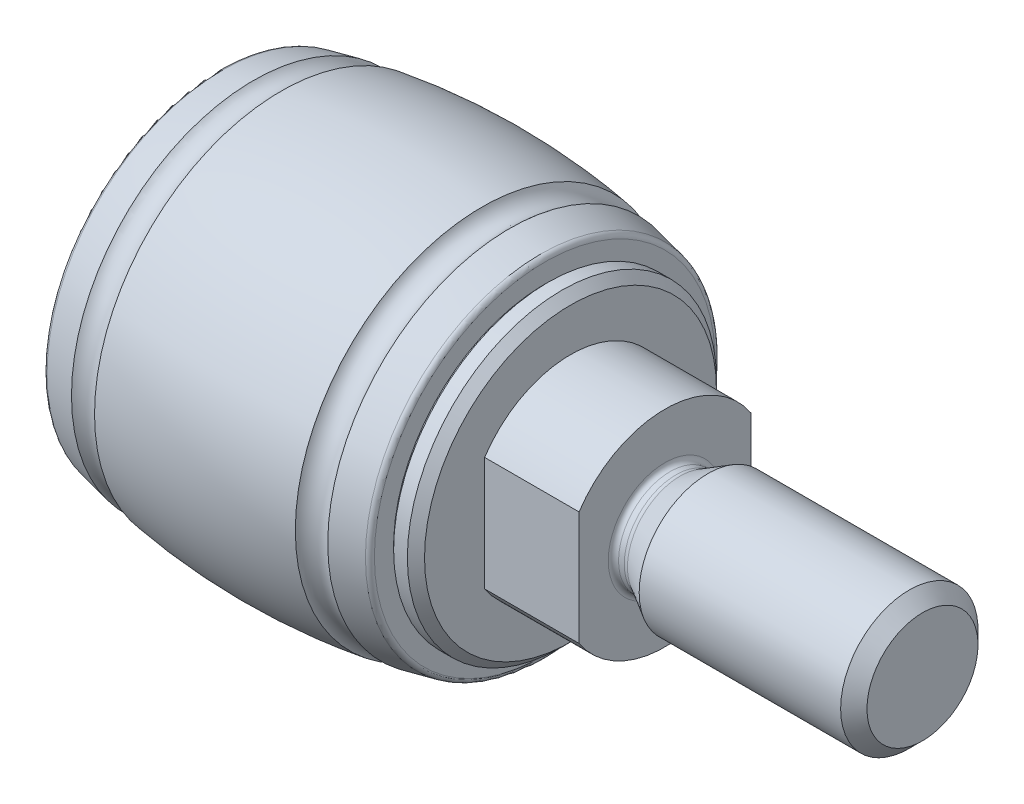
ISO-10303-21;
HEADER;
FILE_DESCRIPTION(('STEP AP214'),'2;1');
FILE_NAME('part.step','',(''),(''),'','','');
FILE_SCHEMA(('AUTOMOTIVE_DESIGN { 1 0 10303 214 1 1 1 1 }'));
ENDSEC;
DATA;
#1=APPLICATION_CONTEXT('core data for automotive mechanical design processes');
#2=APPLICATION_PROTOCOL_DEFINITION('international standard','automotive_design',2000,#1);
#3=PRODUCT_CONTEXT('',#1,'mechanical');
#4=PRODUCT('Part','Part','',(#3));
#5=PRODUCT_RELATED_PRODUCT_CATEGORY('part','',(#4));
#6=PRODUCT_DEFINITION_FORMATION('','',#4);
#7=PRODUCT_DEFINITION_CONTEXT('part definition',#1,'design');
#8=PRODUCT_DEFINITION('design','',#6,#7);
#9=PRODUCT_DEFINITION_SHAPE('','',#8);
#10=(LENGTH_UNIT() NAMED_UNIT(*) SI_UNIT(.MILLI.,.METRE.));
#11=(NAMED_UNIT(*) PLANE_ANGLE_UNIT() SI_UNIT($,.RADIAN.));
#12=(NAMED_UNIT(*) SI_UNIT($,.STERADIAN.) SOLID_ANGLE_UNIT());
#13=UNCERTAINTY_MEASURE_WITH_UNIT(LENGTH_MEASURE(1.E-05),#10,'distance_accuracy_value','');
#14=(GEOMETRIC_REPRESENTATION_CONTEXT(3) GLOBAL_UNCERTAINTY_ASSIGNED_CONTEXT((#13)) GLOBAL_UNIT_ASSIGNED_CONTEXT((#10,
#11,#12)) REPRESENTATION_CONTEXT('',''));
#15=CARTESIAN_POINT('',(0.,0.,0.));
#16=DIRECTION('',(0.,0.,1.));
#17=DIRECTION('',(1.,0.,0.));
#18=AXIS2_PLACEMENT_3D('',#15,#16,#17);
#19=CARTESIAN_POINT('',(260.,0.,0.));
#20=DIRECTION('',(-1.,0.,0.));
#21=DIRECTION('',(0.,0.,1.));
#22=AXIS2_PLACEMENT_3D('',#19,#20,#21);
#23=CYLINDRICAL_SURFACE('',#22,6.);
#24=DIRECTION('',(-1.,0.,0.));
#25=VECTOR('',#24,1.);
#26=CARTESIAN_POINT('',(260.,-3.3166247903554,5.));
#27=LINE('',#26,#25);
#28=CARTESIAN_POINT('',(239.5,-3.3166247903554,5.));
#29=VERTEX_POINT('',#28);
#30=CARTESIAN_POINT('',(245.,-3.3166247903554,5.));
#31=VERTEX_POINT('',#30);
#32=EDGE_CURVE('E59',#29,#31,#27,.F.);
#33=ORIENTED_EDGE('',*,*,#32,.F.);
#34=CARTESIAN_POINT('',(239.5,0.,0.));
#35=DIRECTION('',(-1.,0.,0.));
#36=DIRECTION('',(0.,0.,1.));
#37=AXIS2_PLACEMENT_3D('',#34,#35,#36);
#38=CIRCLE('',#37,6.);
#39=CARTESIAN_POINT('',(239.5,-3.3166247903554,-5.));
#40=VERTEX_POINT('',#39);
#41=EDGE_CURVE('E100',#40,#29,#38,.T.);
#42=ORIENTED_EDGE('',*,*,#41,.F.);
#43=DIRECTION('',(-1.,0.,0.));
#44=VECTOR('',#43,1.);
#45=CARTESIAN_POINT('',(260.,-3.3166247903554,-5.));
#46=LINE('',#45,#44);
#47=CARTESIAN_POINT('',(245.,-3.3166247903554,-5.));
#48=VERTEX_POINT('',#47);
#49=EDGE_CURVE('E85',#48,#40,#46,.T.);
#50=ORIENTED_EDGE('',*,*,#49,.F.);
#51=CARTESIAN_POINT('',(245.,0.,0.));
#52=DIRECTION('',(-1.,0.,0.));
#53=DIRECTION('',(0.,0.,1.));
#54=AXIS2_PLACEMENT_3D('',#51,#52,#53);
#55=CIRCLE('',#54,6.);
#56=EDGE_CURVE('E98',#48,#31,#55,.T.);
#57=ORIENTED_EDGE('',*,*,#56,.T.);
#58=EDGE_LOOP('',(#33,#42,#50,#57));
#59=FACE_BOUND('',#58,.T.);
#60=ADVANCED_FACE('F44',(#59),#23,.T.);
#61=CARTESIAN_POINT('',(238.,9.9192956952868,0.));
#62=DIRECTION('',(1.,0.,0.));
#63=DIRECTION('',(0.,0.,-1.));
#64=AXIS2_PLACEMENT_3D('',#61,#62,#63);
#65=PLANE('',#64);
#66=CARTESIAN_POINT('',(238.,0.,0.));
#67=DIRECTION('',(1.,0.,0.));
#68=DIRECTION('',(0.,0.,-1.));
#69=AXIS2_PLACEMENT_3D('',#66,#67,#68);
#70=CIRCLE('',#69,8.8);
#71=CARTESIAN_POINT('',(238.,0.,-8.8));
#72=VERTEX_POINT('',#71);
#73=EDGE_CURVE('E11',#72,#72,#70,.T.);
#74=ORIENTED_EDGE('',*,*,#73,.F.);
#75=EDGE_LOOP('',(#74));
#76=FACE_BOUND('',#75,.T.);
#77=CARTESIAN_POINT('',(238.,0.,0.));
#78=DIRECTION('',(-1.,0.,0.));
#79=DIRECTION('',(0.,0.,1.));
#80=AXIS2_PLACEMENT_3D('',#77,#78,#79);
#81=CIRCLE('',#80,9.91929569527633);
#82=CARTESIAN_POINT('',(238.,0.,9.91929569527633));
#83=VERTEX_POINT('',#82);
#84=EDGE_CURVE('E125',#83,#83,#81,.T.);
#85=ORIENTED_EDGE('',*,*,#84,.F.);
#86=EDGE_LOOP('',(#85));
#87=FACE_BOUND('',#86,.T.);
#88=ADVANCED_FACE('F167',(#76,#87),#65,.T.);
#89=CARTESIAN_POINT('',(237.699999999986,0.,0.));
#90=DIRECTION('',(-1.,0.,0.));
#91=DIRECTION('',(0.,0.,1.));
#92=AXIS2_PLACEMENT_3D('',#89,#90,#91);
#93=TOROIDAL_SURFACE('',#92,9.91929569527633,0.300000000013543);
#94=ORIENTED_EDGE('',*,*,#84,.T.);
#95=EDGE_LOOP('',(#94));
#96=FACE_BOUND('',#95,.T.);
#97=CARTESIAN_POINT('',(237.76952141058,0.,0.));
#98=DIRECTION('',(-1.,0.,0.));
#99=DIRECTION('',(0.,0.,1.));
#100=AXIS2_PLACEMENT_3D('',#97,#98,#99);
#101=CIRCLE('',#100,10.211129164017);
#102=CARTESIAN_POINT('',(237.76952141058,0.,10.211129164017));
#103=VERTEX_POINT('',#102);
#104=EDGE_CURVE('E128',#103,#103,#101,.T.);
#105=ORIENTED_EDGE('',*,*,#104,.F.);
#106=EDGE_LOOP('',(#105));
#107=FACE_BOUND('',#106,.T.);
#108=ADVANCED_FACE('F175',(#96,#107),#93,.T.);
#109=CARTESIAN_POINT('',(228.500000000643,0.,0.));
#110=DIRECTION('',(-1.,0.,0.));
#111=DIRECTION('',(0.,0.,1.));
#112=AXIS2_PLACEMENT_3D('',#109,#110,#111);
#113=DEGENERATE_TOROIDAL_SURFACE('',#112,28.6999999970046,39.9999999969373,.F.);
#114=ORIENTED_EDGE('',*,*,#104,.T.);
#115=EDGE_LOOP('',(#114));
#116=FACE_BOUND('',#115,.T.);
#117=CARTESIAN_POINT('',(235.96199849014,0.,0.));
#118=DIRECTION('',(-1.,0.,0.));
#119=DIRECTION('',(0.,0.,1.));
#120=AXIS2_PLACEMENT_3D('',#117,#118,#119);
#121=CIRCLE('',#120,10.597819004789);
#122=CARTESIAN_POINT('',(235.96199849014,0.,10.597819004789));
#123=VERTEX_POINT('',#122);
#124=EDGE_CURVE('E131',#123,#123,#121,.T.);
#125=ORIENTED_EDGE('',*,*,#124,.F.);
#126=EDGE_LOOP('',(#125));
#127=FACE_BOUND('',#126,.T.);
#128=ADVANCED_FACE('F305',(#116,#127),#113,.F.);
#129=CARTESIAN_POINT('',(235.249999999998,0.,0.));
#130=DIRECTION('',(-1.,0.,0.));
#131=DIRECTION('',(0.,0.,1.));
#132=AXIS2_PLACEMENT_3D('',#129,#130,#131);
#133=TOROIDAL_SURFACE('',#132,11.3,0.999999999999839);
#134=ORIENTED_EDGE('',*,*,#124,.T.);
#135=EDGE_LOOP('',(#134));
#136=FACE_BOUND('',#135,.T.);
#137=CARTESIAN_POINT('',(234.34700489016,0.,0.));
#138=DIRECTION('',(-1.,0.,0.));
#139=DIRECTION('',(0.,0.,1.));
#140=AXIS2_PLACEMENT_3D('',#137,#138,#139);
#141=CIRCLE('',#140,10.870349174785);
#142=CARTESIAN_POINT('',(234.34700489016,0.,10.870349174785));
#143=VERTEX_POINT('',#142);
#144=EDGE_CURVE('E134',#143,#143,#141,.T.);
#145=ORIENTED_EDGE('',*,*,#144,.F.);
#146=EDGE_LOOP('',(#145));
#147=FACE_BOUND('',#146,.T.);
#148=ADVANCED_FACE('F314',(#136,#147),#133,.F.);
#149=CARTESIAN_POINT('',(228.5,0.,0.));
#150=DIRECTION('',(-1.,0.,0.));
#151=DIRECTION('',(0.,0.,1.));
#152=AXIS2_PLACEMENT_3D('',#149,#150,#151);
#153=DEGENERATE_TOROIDAL_SURFACE('',#152,28.6999999999572,39.9999999999572,.F.);
#154=ORIENTED_EDGE('',*,*,#144,.T.);
#155=EDGE_LOOP('',(#154));
#156=FACE_BOUND('',#155,.T.);
#157=CARTESIAN_POINT('',(222.65299510984,0.,0.));
#158=DIRECTION('',(-1.,0.,0.));
#159=DIRECTION('',(0.,0.,1.));
#160=AXIS2_PLACEMENT_3D('',#157,#158,#159);
#161=CIRCLE('',#160,10.870349174785);
#162=CARTESIAN_POINT('',(222.65299510984,0.,10.870349174785));
#163=VERTEX_POINT('',#162);
#164=EDGE_CURVE('E137',#163,#163,#161,.T.);
#165=ORIENTED_EDGE('',*,*,#164,.F.);
#166=EDGE_LOOP('',(#165));
#167=FACE_BOUND('',#166,.T.);
#168=ADVANCED_FACE('F323',(#156,#167),#153,.F.);
#169=CARTESIAN_POINT('',(221.750000000002,0.,0.));
#170=DIRECTION('',(-1.,0.,0.));
#171=DIRECTION('',(0.,0.,1.));
#172=AXIS2_PLACEMENT_3D('',#169,#170,#171);
#173=TOROIDAL_SURFACE('',#172,11.3,0.999999999999839);
#174=ORIENTED_EDGE('',*,*,#164,.T.);
#175=EDGE_LOOP('',(#174));
#176=FACE_BOUND('',#175,.T.);
#177=CARTESIAN_POINT('',(221.03800150986,0.,0.));
#178=DIRECTION('',(-1.,0.,0.));
#179=DIRECTION('',(0.,0.,1.));
#180=AXIS2_PLACEMENT_3D('',#177,#178,#179);
#181=CIRCLE('',#180,10.597819004789);
#182=CARTESIAN_POINT('',(221.03800150986,0.,10.597819004789));
#183=VERTEX_POINT('',#182);
#184=EDGE_CURVE('E140',#183,#183,#181,.T.);
#185=ORIENTED_EDGE('',*,*,#184,.F.);
#186=EDGE_LOOP('',(#185));
#187=FACE_BOUND('',#186,.T.);
#188=ADVANCED_FACE('F163',(#176,#187),#173,.F.);
#189=CARTESIAN_POINT('',(228.500000000153,0.,0.));
#190=DIRECTION('',(-1.,0.,0.));
#191=DIRECTION('',(0.,0.,1.));
#192=AXIS2_PLACEMENT_3D('',#189,#190,#191);
#193=DEGENERATE_TOROIDAL_SURFACE('',#192,28.7000000007328,40.0000000007485,.F.);
#194=ORIENTED_EDGE('',*,*,#184,.T.);
#195=EDGE_LOOP('',(#194));
#196=FACE_BOUND('',#195,.T.);
#197=CARTESIAN_POINT('',(219.23047866262,0.,0.));
#198=DIRECTION('',(-1.,0.,0.));
#199=DIRECTION('',(0.,0.,1.));
#200=AXIS2_PLACEMENT_3D('',#197,#198,#199);
#201=CIRCLE('',#200,10.211129181455);
#202=CARTESIAN_POINT('',(219.23047866262,0.,10.211129181455));
#203=VERTEX_POINT('',#202);
#204=EDGE_CURVE('E143',#203,#203,#201,.T.);
#205=ORIENTED_EDGE('',*,*,#204,.F.);
#206=EDGE_LOOP('',(#205));
#207=FACE_BOUND('',#206,.T.);
#208=ADVANCED_FACE('F152',(#196,#207),#193,.F.);
#209=CARTESIAN_POINT('',(219.300000000014,0.,0.));
#210=DIRECTION('',(-1.,0.,0.));
#211=DIRECTION('',(0.,0.,1.));
#212=AXIS2_PLACEMENT_3D('',#209,#210,#211);
#213=TOROIDAL_SURFACE('',#212,9.91929569527626,0.300000000013761);
#214=ORIENTED_EDGE('',*,*,#204,.T.);
#215=EDGE_LOOP('',(#214));
#216=FACE_BOUND('',#215,.T.);
#217=CARTESIAN_POINT('',(219.,0.,0.));
#218=DIRECTION('',(-1.,0.,0.));
#219=DIRECTION('',(0.,0.,1.));
#220=AXIS2_PLACEMENT_3D('',#217,#218,#219);
#221=CIRCLE('',#220,9.9192956952868);
#222=CARTESIAN_POINT('',(219.,0.,9.9192956952868));
#223=VERTEX_POINT('',#222);
#224=EDGE_CURVE('E52',#223,#223,#221,.T.);
#225=ORIENTED_EDGE('',*,*,#224,.F.);
#226=EDGE_LOOP('',(#225));
#227=FACE_BOUND('',#226,.T.);
#228=ADVANCED_FACE('F149',(#216,#227),#213,.T.);
#229=CARTESIAN_POINT('',(238.,0.,0.));
#230=DIRECTION('',(1.,0.,0.));
#231=DIRECTION('',(0.,0.,-1.));
#232=AXIS2_PLACEMENT_3D('',#229,#230,#231);
#233=CONICAL_SURFACE('',#232,8.8,0.785398163397505);
#234=CARTESIAN_POINT('',(238.2,0.,0.));
#235=DIRECTION('',(-1.,0.,0.));
#236=DIRECTION('',(0.,0.,1.));
#237=AXIS2_PLACEMENT_3D('',#234,#235,#236);
#238=CIRCLE('',#237,9.);
#239=CARTESIAN_POINT('',(238.2,0.,9.));
#240=VERTEX_POINT('',#239);
#241=EDGE_CURVE('E122',#240,#240,#238,.T.);
#242=ORIENTED_EDGE('',*,*,#241,.T.);
#243=EDGE_LOOP('',(#242));
#244=FACE_BOUND('',#243,.T.);
#245=ORIENTED_EDGE('',*,*,#73,.T.);
#246=EDGE_LOOP('',(#245));
#247=FACE_BOUND('',#246,.T.);
#248=ADVANCED_FACE('F151',(#244,#247),#233,.T.);
#249=CARTESIAN_POINT('',(260.,0.,0.));
#250=DIRECTION('',(-1.,0.,0.));
#251=DIRECTION('',(0.,0.,1.));
#252=AXIS2_PLACEMENT_3D('',#249,#250,#251);
#253=CYLINDRICAL_SURFACE('',#252,9.);
#254=CARTESIAN_POINT('',(239.,0.,0.));
#255=DIRECTION('',(-1.,0.,0.));
#256=DIRECTION('',(0.,0.,1.));
#257=AXIS2_PLACEMENT_3D('',#254,#255,#256);
#258=CIRCLE('',#257,9.);
#259=CARTESIAN_POINT('',(239.,0.,9.));
#260=VERTEX_POINT('',#259);
#261=EDGE_CURVE('E119',#260,#260,#258,.T.);
#262=ORIENTED_EDGE('',*,*,#261,.T.);
#263=EDGE_LOOP('',(#262));
#264=FACE_BOUND('',#263,.T.);
#265=ORIENTED_EDGE('',*,*,#241,.F.);
#266=EDGE_LOOP('',(#265));
#267=FACE_BOUND('',#266,.T.);
#268=ADVANCED_FACE('F160',(#264,#267),#253,.T.);
#269=CARTESIAN_POINT('',(239.,0.,0.));
#270=DIRECTION('',(-1.,0.,0.));
#271=DIRECTION('',(0.,0.,1.));
#272=AXIS2_PLACEMENT_3D('',#269,#270,#271);
#273=CONICAL_SURFACE('',#272,9.,0.785398163397448);
#274=CARTESIAN_POINT('',(239.5,0.,0.));
#275=DIRECTION('',(-1.,0.,0.));
#276=DIRECTION('',(0.,0.,1.));
#277=AXIS2_PLACEMENT_3D('',#274,#275,#276);
#278=CIRCLE('',#277,8.5);
#279=CARTESIAN_POINT('',(239.5,0.,8.5));
#280=VERTEX_POINT('',#279);
#281=EDGE_CURVE('E116',#280,#280,#278,.T.);
#282=ORIENTED_EDGE('',*,*,#281,.T.);
#283=EDGE_LOOP('',(#282));
#284=FACE_BOUND('',#283,.T.);
#285=ORIENTED_EDGE('',*,*,#261,.F.);
#286=EDGE_LOOP('',(#285));
#287=FACE_BOUND('',#286,.T.);
#288=ADVANCED_FACE('F188',(#284,#287),#273,.T.);
#289=CARTESIAN_POINT('',(239.5,8.5,0.));
#290=DIRECTION('',(1.,0.,0.));
#291=DIRECTION('',(0.,0.,-1.));
#292=AXIS2_PLACEMENT_3D('',#289,#290,#291);
#293=PLANE('',#292);
#294=ORIENTED_EDGE('',*,*,#41,.T.);
#295=DIRECTION('',(0.,1.,0.));
#296=VECTOR('',#295,1.);
#297=CARTESIAN_POINT('',(239.5,-10.,5.));
#298=LINE('',#297,#296);
#299=CARTESIAN_POINT('',(239.5,3.3166247903554,5.));
#300=VERTEX_POINT('',#299);
#301=EDGE_CURVE('E92',#29,#300,#298,.T.);
#302=ORIENTED_EDGE('',*,*,#301,.T.);
#303=CARTESIAN_POINT('',(239.5,3.3166247903554,-5.));
#304=VERTEX_POINT('',#303);
#305=EDGE_CURVE('E113',#300,#304,#38,.T.);
#306=ORIENTED_EDGE('',*,*,#305,.T.);
#307=DIRECTION('',(0.,-1.,0.));
#308=VECTOR('',#307,1.);
#309=CARTESIAN_POINT('',(239.5,10.,-5.));
#310=LINE('',#309,#308);
#311=EDGE_CURVE('E101',#304,#40,#310,.T.);
#312=ORIENTED_EDGE('',*,*,#311,.T.);
#313=EDGE_LOOP('',(#294,#302,#306,#312));
#314=FACE_BOUND('',#313,.T.);
#315=ORIENTED_EDGE('',*,*,#281,.F.);
#316=EDGE_LOOP('',(#315));
#317=FACE_BOUND('',#316,.T.);
#318=ADVANCED_FACE('F180',(#314,#317),#293,.T.);
#319=DIRECTION('',(-1.,0.,0.));
#320=VECTOR('',#319,1.);
#321=CARTESIAN_POINT('',(260.,3.3166247903554,5.));
#322=LINE('',#321,#320);
#323=CARTESIAN_POINT('',(245.,3.3166247903554,5.));
#324=VERTEX_POINT('',#323);
#325=EDGE_CURVE('E192',#324,#300,#322,.T.);
#326=ORIENTED_EDGE('',*,*,#325,.F.);
#327=CARTESIAN_POINT('',(245.,3.3166247903554,-5.));
#328=VERTEX_POINT('',#327);
#329=EDGE_CURVE('E105',#324,#328,#55,.T.);
#330=ORIENTED_EDGE('',*,*,#329,.T.);
#331=DIRECTION('',(-1.,0.,0.));
#332=VECTOR('',#331,1.);
#333=CARTESIAN_POINT('',(260.,3.3166247903554,-5.));
#334=LINE('',#333,#332);
#335=EDGE_CURVE('E67',#304,#328,#334,.F.);
#336=ORIENTED_EDGE('',*,*,#335,.F.);
#337=ORIENTED_EDGE('',*,*,#305,.F.);
#338=EDGE_LOOP('',(#326,#330,#336,#337));
#339=FACE_BOUND('',#338,.T.);
#340=ADVANCED_FACE('F169',(#339),#23,.T.);
#341=CARTESIAN_POINT('',(245.,6.,0.));
#342=DIRECTION('',(1.,0.,0.));
#343=DIRECTION('',(0.,0.,-1.));
#344=AXIS2_PLACEMENT_3D('',#341,#342,#343);
#345=PLANE('',#344);
#346=DIRECTION('',(0.,1.,0.));
#347=VECTOR('',#346,1.);
#348=CARTESIAN_POINT('',(245.,-10.,5.));
#349=LINE('',#348,#347);
#350=EDGE_CURVE('E93',#31,#324,#349,.T.);
#351=ORIENTED_EDGE('',*,*,#350,.F.);
#352=ORIENTED_EDGE('',*,*,#56,.F.);
#353=DIRECTION('',(0.,-1.,0.));
#354=VECTOR('',#353,1.);
#355=CARTESIAN_POINT('',(245.,10.,-5.));
#356=LINE('',#355,#354);
#357=EDGE_CURVE('E82',#328,#48,#356,.T.);
#358=ORIENTED_EDGE('',*,*,#357,.F.);
#359=ORIENTED_EDGE('',*,*,#329,.F.);
#360=EDGE_LOOP('',(#351,#352,#358,#359));
#361=FACE_BOUND('',#360,.T.);
#362=CARTESIAN_POINT('',(245.,0.,0.));
#363=DIRECTION('',(-1.,0.,0.));
#364=DIRECTION('',(0.,0.,1.));
#365=AXIS2_PLACEMENT_3D('',#362,#363,#364);
#366=CIRCLE('',#365,3.3);
#367=CARTESIAN_POINT('',(245.,0.,3.3));
#368=VERTEX_POINT('',#367);
#369=EDGE_CURVE('E106',#368,#368,#366,.T.);
#370=ORIENTED_EDGE('',*,*,#369,.T.);
#371=EDGE_LOOP('',(#370));
#372=FACE_BOUND('',#371,.T.);
#373=ADVANCED_FACE('F103',(#361,#372),#345,.T.);
#374=CARTESIAN_POINT('',(245.299999999993,0.,0.));
#375=DIRECTION('',(-1.,0.,0.));
#376=DIRECTION('',(0.,0.,1.));
#377=AXIS2_PLACEMENT_3D('',#374,#375,#376);
#378=TOROIDAL_SURFACE('',#377,3.29999999999307,0.299999999993077);
#379=CARTESIAN_POINT('',(245.3,0.,0.));
#380=DIRECTION('',(-1.,0.,0.));
#381=DIRECTION('',(0.,0.,1.));
#382=AXIS2_PLACEMENT_3D('',#379,#380,#381);
#383=CIRCLE('',#382,2.99999999999999);
#384=CARTESIAN_POINT('',(245.3,0.,2.99999999999999));
#385=VERTEX_POINT('',#384);
#386=EDGE_CURVE('E109',#385,#385,#383,.T.);
#387=ORIENTED_EDGE('',*,*,#386,.T.);
#388=EDGE_LOOP('',(#387));
#389=FACE_BOUND('',#388,.T.);
#390=ORIENTED_EDGE('',*,*,#369,.F.);
#391=EDGE_LOOP('',(#390));
#392=FACE_BOUND('',#391,.T.);
#393=ADVANCED_FACE('F186',(#389,#392),#378,.F.);
#394=CARTESIAN_POINT('',(260.,0.,0.));
#395=DIRECTION('',(-1.,0.,0.));
#396=DIRECTION('',(0.,0.,1.));
#397=AXIS2_PLACEMENT_3D('',#394,#395,#396);
#398=CYLINDRICAL_SURFACE('',#397,3.);
#399=CARTESIAN_POINT('',(245.63397459622,0.,0.));
#400=DIRECTION('',(-1.,0.,0.));
#401=DIRECTION('',(0.,0.,1.));
#402=AXIS2_PLACEMENT_3D('',#399,#400,#401);
#403=CIRCLE('',#402,3.);
#404=CARTESIAN_POINT('',(245.63397459622,0.,3.));
#405=VERTEX_POINT('',#404);
#406=EDGE_CURVE('E210',#405,#405,#403,.T.);
#407=ORIENTED_EDGE('',*,*,#406,.T.);
#408=EDGE_LOOP('',(#407));
#409=FACE_BOUND('',#408,.T.);
#410=ORIENTED_EDGE('',*,*,#386,.F.);
#411=EDGE_LOOP('',(#410));
#412=FACE_BOUND('',#411,.T.);
#413=ADVANCED_FACE('F217',(#409,#412),#398,.T.);
#414=CARTESIAN_POINT('',(245.633974596217,0.,0.));
#415=DIRECTION('',(-1.,0.,0.));
#416=DIRECTION('',(0.,0.,1.));
#417=AXIS2_PLACEMENT_3D('',#414,#415,#416);
#418=TOROIDAL_SURFACE('',#417,3.50000000000998,0.500000000009988);
#419=CARTESIAN_POINT('',(245.88397459622,0.,0.));
#420=DIRECTION('',(-1.,0.,0.));
#421=DIRECTION('',(0.,0.,1.));
#422=AXIS2_PLACEMENT_3D('',#419,#420,#421);
#423=CIRCLE('',#422,3.0669872981078);
#424=CARTESIAN_POINT('',(245.88397459622,0.,3.0669872981078));
#425=VERTEX_POINT('',#424);
#426=EDGE_CURVE('E207',#425,#425,#423,.T.);
#427=ORIENTED_EDGE('',*,*,#426,.T.);
#428=EDGE_LOOP('',(#427));
#429=FACE_BOUND('',#428,.T.);
#430=ORIENTED_EDGE('',*,*,#406,.F.);
#431=EDGE_LOOP('',(#430));
#432=FACE_BOUND('',#431,.T.);
#433=ADVANCED_FACE('F219',(#429,#432),#418,.F.);
#434=CARTESIAN_POINT('',(245.88397459622,0.,0.));
#435=DIRECTION('',(1.,0.,0.));
#436=DIRECTION('',(0.,0.,-1.));
#437=AXIS2_PLACEMENT_3D('',#434,#435,#436);
#438=CONICAL_SURFACE('',#437,3.0669872981078,0.523598775599484);
#439=CARTESIAN_POINT('',(247.5,0.,0.));
#440=DIRECTION('',(-1.,0.,0.));
#441=DIRECTION('',(0.,0.,1.));
#442=AXIS2_PLACEMENT_3D('',#439,#440,#441);
#443=CIRCLE('',#442,4.);
#444=CARTESIAN_POINT('',(247.5,0.,4.));
#445=VERTEX_POINT('',#444);
#446=EDGE_CURVE('E204',#445,#445,#443,.T.);
#447=ORIENTED_EDGE('',*,*,#446,.T.);
#448=EDGE_LOOP('',(#447));
#449=FACE_BOUND('',#448,.T.);
#450=ORIENTED_EDGE('',*,*,#426,.F.);
#451=EDGE_LOOP('',(#450));
#452=FACE_BOUND('',#451,.T.);
#453=ADVANCED_FACE('F226',(#449,#452),#438,.T.);
#454=CARTESIAN_POINT('',(260.,0.,0.));
#455=DIRECTION('',(-1.,0.,0.));
#456=DIRECTION('',(0.,0.,1.));
#457=AXIS2_PLACEMENT_3D('',#454,#455,#456);
#458=CYLINDRICAL_SURFACE('',#457,4.);
#459=CARTESIAN_POINT('',(259.233,0.,0.));
#460=DIRECTION('',(-1.,0.,0.));
#461=DIRECTION('',(0.,0.,1.));
#462=AXIS2_PLACEMENT_3D('',#459,#460,#461);
#463=CIRCLE('',#462,4.);
#464=CARTESIAN_POINT('',(259.233,0.,4.));
#465=VERTEX_POINT('',#464);
#466=EDGE_CURVE('E201',#465,#465,#463,.T.);
#467=ORIENTED_EDGE('',*,*,#466,.T.);
#468=EDGE_LOOP('',(#467));
#469=FACE_BOUND('',#468,.T.);
#470=ORIENTED_EDGE('',*,*,#446,.F.);
#471=EDGE_LOOP('',(#470));
#472=FACE_BOUND('',#471,.T.);
#473=ADVANCED_FACE('F234',(#469,#472),#458,.T.);
#474=CARTESIAN_POINT('',(259.233,0.,0.));
#475=DIRECTION('',(-1.,0.,0.));
#476=DIRECTION('',(0.,0.,1.));
#477=AXIS2_PLACEMENT_3D('',#474,#475,#476);
#478=CONICAL_SURFACE('',#477,4.,0.785398163397437);
#479=CARTESIAN_POINT('',(260.,0.,0.));
#480=DIRECTION('',(-1.,0.,0.));
#481=DIRECTION('',(0.,0.,1.));
#482=AXIS2_PLACEMENT_3D('',#479,#480,#481);
#483=CIRCLE('',#482,3.233);
#484=CARTESIAN_POINT('',(260.,0.,3.233));
#485=VERTEX_POINT('',#484);
#486=EDGE_CURVE('E195',#485,#485,#483,.T.);
#487=ORIENTED_EDGE('',*,*,#486,.T.);
#488=EDGE_LOOP('',(#487));
#489=FACE_BOUND('',#488,.T.);
#490=ORIENTED_EDGE('',*,*,#466,.F.);
#491=EDGE_LOOP('',(#490));
#492=FACE_BOUND('',#491,.T.);
#493=ADVANCED_FACE('F238',(#489,#492),#478,.T.);
#494=CARTESIAN_POINT('',(260.,3.233,0.));
#495=DIRECTION('',(1.,0.,0.));
#496=DIRECTION('',(0.,0.,-1.));
#497=AXIS2_PLACEMENT_3D('',#494,#495,#496);
#498=PLANE('',#497);
#499=ORIENTED_EDGE('',*,*,#486,.F.);
#500=EDGE_LOOP('',(#499));
#501=FACE_BOUND('',#500,.T.);
#502=ADVANCED_FACE('F242',(#501),#498,.T.);
#503=CARTESIAN_POINT('',(239.5,10.,-5.));
#504=DIRECTION('',(0.,0.,1.));
#505=DIRECTION('',(1.,0.,0.));
#506=AXIS2_PLACEMENT_3D('',#503,#504,#505);
#507=PLANE('',#506);
#508=ORIENTED_EDGE('',*,*,#335,.T.);
#509=ORIENTED_EDGE('',*,*,#357,.T.);
#510=ORIENTED_EDGE('',*,*,#49,.T.);
#511=ORIENTED_EDGE('',*,*,#311,.F.);
#512=EDGE_LOOP('',(#508,#509,#510,#511));
#513=FACE_BOUND('',#512,.T.);
#514=ADVANCED_FACE('F84',(#513),#507,.F.);
#515=CARTESIAN_POINT('',(239.5,-10.,5.));
#516=DIRECTION('',(0.,0.,-1.));
#517=DIRECTION('',(-1.,0.,0.));
#518=AXIS2_PLACEMENT_3D('',#515,#516,#517);
#519=PLANE('',#518);
#520=ORIENTED_EDGE('',*,*,#32,.T.);
#521=ORIENTED_EDGE('',*,*,#350,.T.);
#522=ORIENTED_EDGE('',*,*,#325,.T.);
#523=ORIENTED_EDGE('',*,*,#301,.F.);
#524=EDGE_LOOP('',(#520,#521,#522,#523));
#525=FACE_BOUND('',#524,.T.);
#526=ADVANCED_FACE('F247',(#525),#519,.F.);
#527=CARTESIAN_POINT('',(219.,0.,0.));
#528=DIRECTION('',(-1.,0.,0.));
#529=DIRECTION('',(0.,0.,1.));
#530=AXIS2_PLACEMENT_3D('',#527,#528,#529);
#531=PLANE('',#530);
#532=ORIENTED_EDGE('',*,*,#224,.T.);
#533=EDGE_LOOP('',(#532));
#534=FACE_BOUND('',#533,.T.);
#535=ADVANCED_FACE('F46',(#534),#531,.T.);
#536=CLOSED_SHELL('',(#60,#88,#108,#128,#148,#168,#188,#208,#228,#248,#268,#288,#318,#340,#373,
#393,#413,#433,#453,#473,#493,#502,#514,#526,#535));
#537=MANIFOLD_SOLID_BREP('B2',#536);
#538=ADVANCED_BREP_SHAPE_REPRESENTATION('',(#18,#537),#14);
#539=SHAPE_DEFINITION_REPRESENTATION(#9,#538);
ENDSEC;
END-ISO-10303-21;
